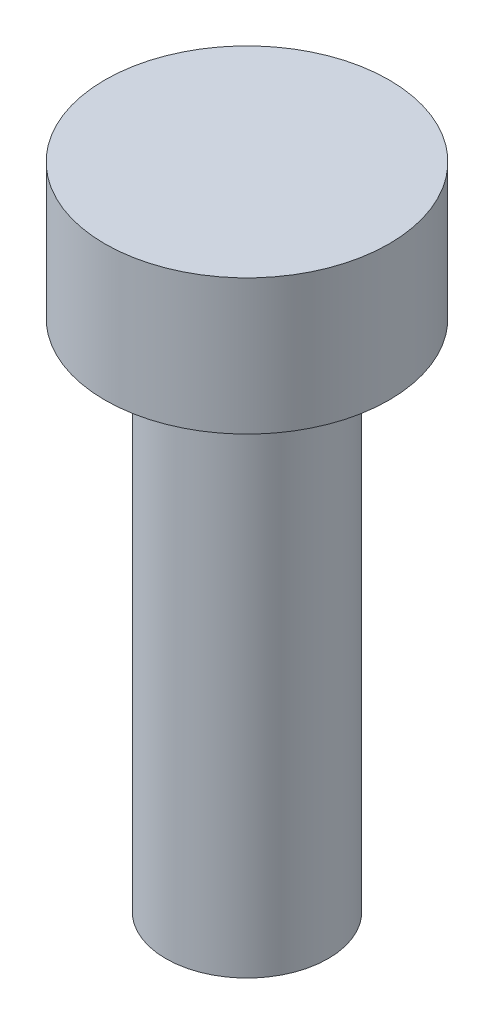
ISO-10303-21;
HEADER;
FILE_DESCRIPTION(('STEP AP214'),'2;1');
FILE_NAME('part.step','',(''),(''),'','','');
FILE_SCHEMA(('AUTOMOTIVE_DESIGN { 1 0 10303 214 1 1 1 1 }'));
ENDSEC;
DATA;
#1=APPLICATION_CONTEXT('core data for automotive mechanical design processes');
#2=APPLICATION_PROTOCOL_DEFINITION('international standard','automotive_design',2000,#1);
#3=PRODUCT_CONTEXT('',#1,'mechanical');
#4=PRODUCT('Part','Part','',(#3));
#5=PRODUCT_RELATED_PRODUCT_CATEGORY('part','',(#4));
#6=PRODUCT_DEFINITION_FORMATION('','',#4);
#7=PRODUCT_DEFINITION_CONTEXT('part definition',#1,'design');
#8=PRODUCT_DEFINITION('design','',#6,#7);
#9=PRODUCT_DEFINITION_SHAPE('','',#8);
#10=(LENGTH_UNIT() NAMED_UNIT(*) SI_UNIT(.MILLI.,.METRE.));
#11=(NAMED_UNIT(*) PLANE_ANGLE_UNIT() SI_UNIT($,.RADIAN.));
#12=(NAMED_UNIT(*) SI_UNIT($,.STERADIAN.) SOLID_ANGLE_UNIT());
#13=UNCERTAINTY_MEASURE_WITH_UNIT(LENGTH_MEASURE(1.E-05),#10,'distance_accuracy_value','');
#14=(GEOMETRIC_REPRESENTATION_CONTEXT(3) GLOBAL_UNCERTAINTY_ASSIGNED_CONTEXT((#13)) GLOBAL_UNIT_ASSIGNED_CONTEXT((#10,
#11,#12)) REPRESENTATION_CONTEXT('',''));
#15=CARTESIAN_POINT('',(0.,0.,0.));
#16=DIRECTION('',(0.,0.,1.));
#17=DIRECTION('',(1.,0.,0.));
#18=AXIS2_PLACEMENT_3D('',#15,#16,#17);
#19=CARTESIAN_POINT('',(0.,0.,0.));
#20=DIRECTION('',(0.,1.,0.));
#21=DIRECTION('',(0.,0.,1.));
#22=AXIS2_PLACEMENT_3D('',#19,#20,#21);
#23=PLANE('',#22);
#24=CARTESIAN_POINT('',(0.,0.,0.));
#25=DIRECTION('',(0.,1.,0.));
#26=DIRECTION('',(0.,0.,1.));
#27=AXIS2_PLACEMENT_3D('',#24,#25,#26);
#28=CIRCLE('',#27,2.667);
#29=CARTESIAN_POINT('',(0.,0.,2.667));
#30=VERTEX_POINT('',#29);
#31=EDGE_CURVE('E44',#30,#30,#28,.T.);
#32=ORIENTED_EDGE('',*,*,#31,.F.);
#33=EDGE_LOOP('',(#32));
#34=FACE_BOUND('',#33,.T.);
#35=CARTESIAN_POINT('',(0.,0.,0.));
#36=DIRECTION('',(0.,1.,0.));
#37=DIRECTION('',(0.,0.,1.));
#38=AXIS2_PLACEMENT_3D('',#35,#36,#37);
#39=CIRCLE('',#38,1.524);
#40=CARTESIAN_POINT('',(0.,0.,1.524));
#41=VERTEX_POINT('',#40);
#42=EDGE_CURVE('E10',#41,#41,#39,.F.);
#43=ORIENTED_EDGE('',*,*,#42,.F.);
#44=EDGE_LOOP('',(#43));
#45=FACE_BOUND('',#44,.T.);
#46=ADVANCED_FACE('F33',(#34,#45),#23,.F.);
#47=CARTESIAN_POINT('',(0.,2.54,0.));
#48=DIRECTION('',(0.,-1.,0.));
#49=DIRECTION('',(0.,0.,-1.));
#50=AXIS2_PLACEMENT_3D('',#47,#48,#49);
#51=CYLINDRICAL_SURFACE('',#50,2.667);
#52=CARTESIAN_POINT('',(0.,2.54,0.));
#53=DIRECTION('',(0.,1.,0.));
#54=DIRECTION('',(0.,0.,1.));
#55=AXIS2_PLACEMENT_3D('',#52,#53,#54);
#56=CIRCLE('',#55,2.667);
#57=CARTESIAN_POINT('',(0.,2.54,2.667));
#58=VERTEX_POINT('',#57);
#59=EDGE_CURVE('E40',#58,#58,#56,.T.);
#60=ORIENTED_EDGE('',*,*,#59,.F.);
#61=EDGE_LOOP('',(#60));
#62=FACE_BOUND('',#61,.T.);
#63=ORIENTED_EDGE('',*,*,#31,.T.);
#64=EDGE_LOOP('',(#63));
#65=FACE_BOUND('',#64,.T.);
#66=ADVANCED_FACE('F35',(#62,#65),#51,.T.);
#67=CARTESIAN_POINT('',(0.,2.54,0.));
#68=DIRECTION('',(0.,1.,0.));
#69=DIRECTION('',(0.,0.,1.));
#70=AXIS2_PLACEMENT_3D('',#67,#68,#69);
#71=PLANE('',#70);
#72=ORIENTED_EDGE('',*,*,#59,.T.);
#73=EDGE_LOOP('',(#72));
#74=FACE_BOUND('',#73,.T.);
#75=ADVANCED_FACE('F58',(#74),#71,.T.);
#76=CARTESIAN_POINT('',(0.,-9.652,0.));
#77=DIRECTION('',(0.,1.,0.));
#78=DIRECTION('',(0.,0.,1.));
#79=AXIS2_PLACEMENT_3D('',#76,#77,#78);
#80=CYLINDRICAL_SURFACE('',#79,1.524);
#81=CARTESIAN_POINT('',(0.,-9.652,0.));
#82=DIRECTION('',(0.,-1.,0.));
#83=DIRECTION('',(0.,0.,-1.));
#84=AXIS2_PLACEMENT_3D('',#81,#82,#83);
#85=CIRCLE('',#84,1.524);
#86=CARTESIAN_POINT('',(0.,-9.652,-1.524));
#87=VERTEX_POINT('',#86);
#88=EDGE_CURVE('E49',#87,#87,#85,.T.);
#89=ORIENTED_EDGE('',*,*,#88,.F.);
#90=EDGE_LOOP('',(#89));
#91=FACE_BOUND('',#90,.T.);
#92=ORIENTED_EDGE('',*,*,#42,.T.);
#93=EDGE_LOOP('',(#92));
#94=FACE_BOUND('',#93,.T.);
#95=ADVANCED_FACE('F56',(#91,#94),#80,.T.);
#96=CARTESIAN_POINT('',(0.,-9.652,0.));
#97=DIRECTION('',(0.,-1.,0.));
#98=DIRECTION('',(0.,0.,-1.));
#99=AXIS2_PLACEMENT_3D('',#96,#97,#98);
#100=PLANE('',#99);
#101=ORIENTED_EDGE('',*,*,#88,.T.);
#102=EDGE_LOOP('',(#101));
#103=FACE_BOUND('',#102,.T.);
#104=ADVANCED_FACE('F54',(#103),#100,.T.);
#105=CLOSED_SHELL('',(#46,#66,#75,#95,#104));
#106=MANIFOLD_SOLID_BREP('B2',#105);
#107=ADVANCED_BREP_SHAPE_REPRESENTATION('',(#18,#106),#14);
#108=SHAPE_DEFINITION_REPRESENTATION(#9,#107);
ENDSEC;
END-ISO-10303-21;
